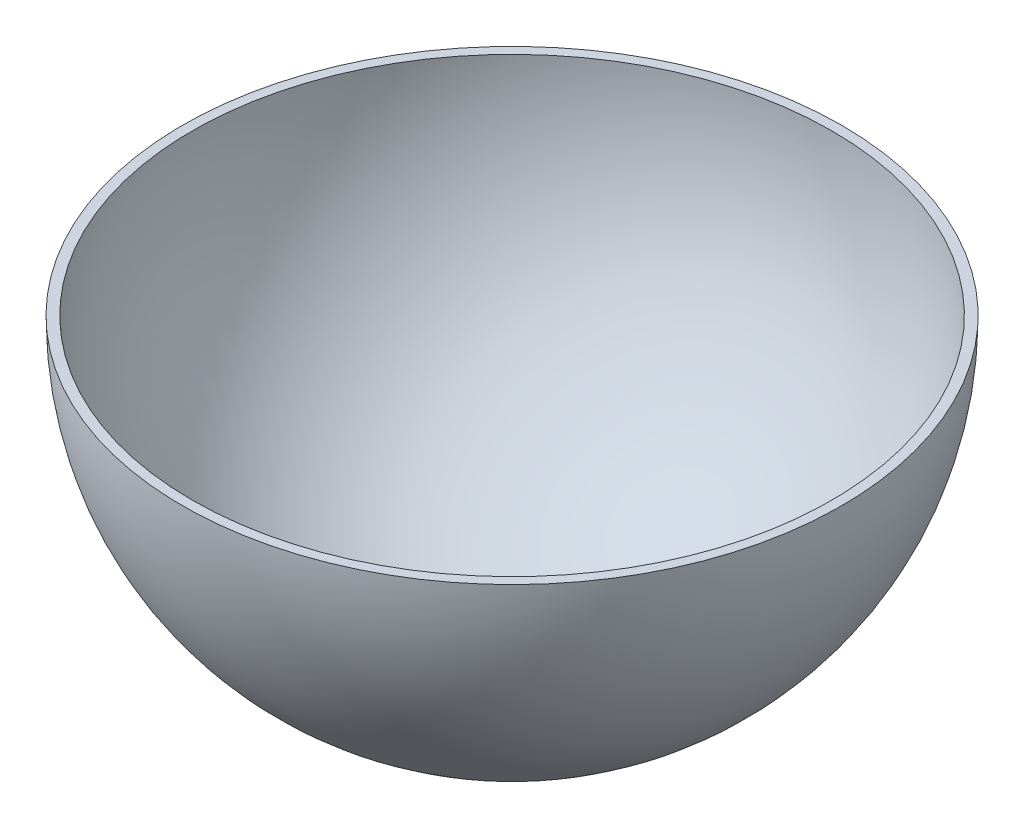
ISO-10303-21;
HEADER;
FILE_DESCRIPTION(('STEP AP214'),'2;1');
FILE_NAME('part.step','',(''),(''),'','','');
FILE_SCHEMA(('AUTOMOTIVE_DESIGN { 1 0 10303 214 1 1 1 1 }'));
ENDSEC;
DATA;
#1=APPLICATION_CONTEXT('core data for automotive mechanical design processes');
#2=APPLICATION_PROTOCOL_DEFINITION('international standard','automotive_design',2000,#1);
#3=PRODUCT_CONTEXT('',#1,'mechanical');
#4=PRODUCT('Part','Part','',(#3));
#5=PRODUCT_RELATED_PRODUCT_CATEGORY('part','',(#4));
#6=PRODUCT_DEFINITION_FORMATION('','',#4);
#7=PRODUCT_DEFINITION_CONTEXT('part definition',#1,'design');
#8=PRODUCT_DEFINITION('design','',#6,#7);
#9=PRODUCT_DEFINITION_SHAPE('','',#8);
#10=(LENGTH_UNIT() NAMED_UNIT(*) SI_UNIT(.MILLI.,.METRE.));
#11=(NAMED_UNIT(*) PLANE_ANGLE_UNIT() SI_UNIT($,.RADIAN.));
#12=(NAMED_UNIT(*) SI_UNIT($,.STERADIAN.) SOLID_ANGLE_UNIT());
#13=UNCERTAINTY_MEASURE_WITH_UNIT(LENGTH_MEASURE(1.E-05),#10,'distance_accuracy_value','');
#14=(GEOMETRIC_REPRESENTATION_CONTEXT(3) GLOBAL_UNCERTAINTY_ASSIGNED_CONTEXT((#13)) GLOBAL_UNIT_ASSIGNED_CONTEXT((#10,
#11,#12)) REPRESENTATION_CONTEXT('',''));
#15=CARTESIAN_POINT('',(0.,0.,0.));
#16=DIRECTION('',(0.,0.,1.));
#17=DIRECTION('',(1.,0.,0.));
#18=AXIS2_PLACEMENT_3D('',#15,#16,#17);
#19=CARTESIAN_POINT('',(0.,0.,0.));
#20=DIRECTION('',(-1.,0.,0.));
#21=DIRECTION('',(0.,0.,1.));
#22=AXIS2_PLACEMENT_3D('',#19,#20,#21);
#23=SPHERICAL_SURFACE('',#22,101.6);
#24=CARTESIAN_POINT('',(0.,0.,0.));
#25=DIRECTION('',(0.,-1.,0.));
#26=DIRECTION('',(0.,0.,-1.));
#27=AXIS2_PLACEMENT_3D('',#24,#25,#26);
#28=SPHERICAL_SURFACE('',#27,101.6);
#29=CARTESIAN_POINT('',(0.,0.,0.));
#30=DIRECTION('',(0.,-1.,0.));
#31=DIRECTION('',(0.,0.,-1.));
#32=AXIS2_PLACEMENT_3D('',#29,#30,#31);
#33=CIRCLE('',#32,101.6);
#34=CARTESIAN_POINT('',(0.,7.09469008052925E-13,-101.6));
#35=VERTEX_POINT('',#34);
#36=EDGE_CURVE('E37',#35,#35,#33,.T.);
#37=ORIENTED_EDGE('',*,*,#36,.T.);
#38=EDGE_LOOP('',(#37));
#39=FACE_BOUND('',#38,.T.);
#40=ADVANCED_FACE('F30',(#39),#28,.T.);
#41=CARTESIAN_POINT('',(0.,0.,0.));
#42=DIRECTION('',(-1.,0.,0.));
#43=DIRECTION('',(0.,0.,1.));
#44=AXIS2_PLACEMENT_3D('',#41,#42,#43);
#45=SPHERICAL_SURFACE('',#44,98.6);
#46=CARTESIAN_POINT('',(0.,0.,0.));
#47=DIRECTION('',(0.,1.,0.));
#48=DIRECTION('',(0.,0.,1.));
#49=AXIS2_PLACEMENT_3D('',#46,#47,#48);
#50=SPHERICAL_SURFACE('',#49,98.6);
#51=CARTESIAN_POINT('',(0.,0.,0.));
#52=DIRECTION('',(0.,1.,0.));
#53=DIRECTION('',(0.,0.,1.));
#54=AXIS2_PLACEMENT_3D('',#51,#52,#53);
#55=CIRCLE('',#54,98.6);
#56=CARTESIAN_POINT('',(0.,-6.88520120019866E-13,98.6));
#57=VERTEX_POINT('',#56);
#58=EDGE_CURVE('E10',#57,#57,#55,.T.);
#59=ORIENTED_EDGE('',*,*,#58,.T.);
#60=EDGE_LOOP('',(#59));
#61=FACE_BOUND('',#60,.T.);
#62=ADVANCED_FACE('F32',(#61),#50,.F.);
#63=CARTESIAN_POINT('',(0.,0.,0.));
#64=DIRECTION('',(0.,-1.,0.));
#65=DIRECTION('',(0.,0.,-1.));
#66=AXIS2_PLACEMENT_3D('',#63,#64,#65);
#67=PLANE('',#66);
#68=ORIENTED_EDGE('',*,*,#58,.F.);
#69=EDGE_LOOP('',(#68));
#70=FACE_BOUND('',#69,.T.);
#71=ORIENTED_EDGE('',*,*,#36,.F.);
#72=EDGE_LOOP('',(#71));
#73=FACE_BOUND('',#72,.T.);
#74=ADVANCED_FACE('F44',(#70,#73),#67,.F.);
#75=CLOSED_SHELL('',(#40,#62,#74));
#76=MANIFOLD_SOLID_BREP('B2',#75);
#77=ADVANCED_BREP_SHAPE_REPRESENTATION('',(#18,#76),#14);
#78=SHAPE_DEFINITION_REPRESENTATION(#9,#77);
ENDSEC;
END-ISO-10303-21;
